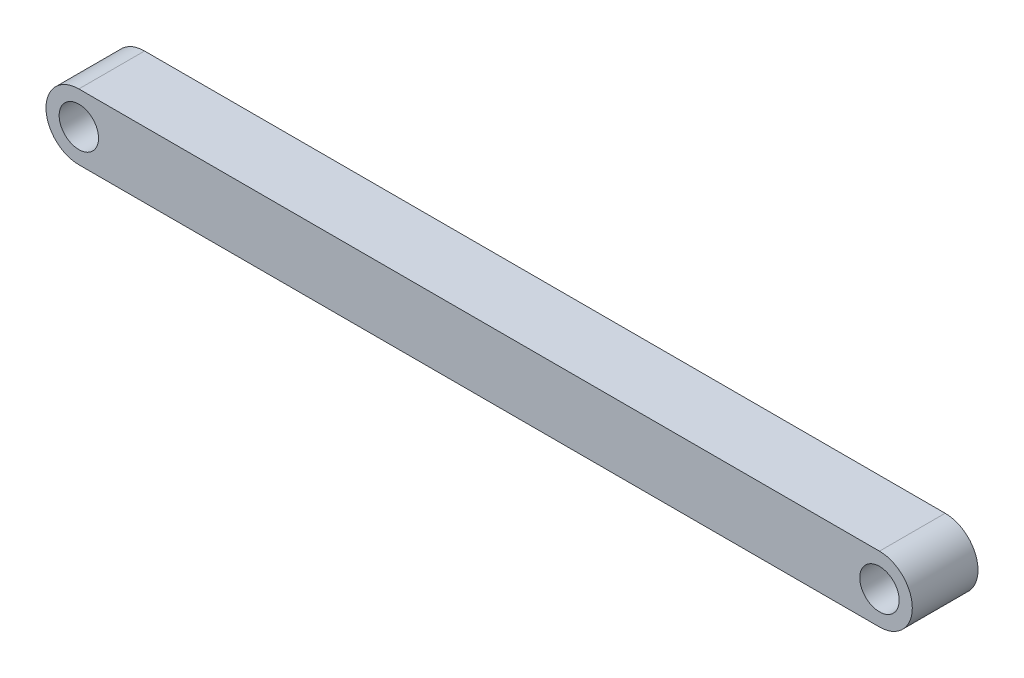
ISO-10303-21;
HEADER;
FILE_DESCRIPTION(('STEP AP214'),'2;1');
FILE_NAME('part.step','',(''),(''),'','','');
FILE_SCHEMA(('AUTOMOTIVE_DESIGN { 1 0 10303 214 1 1 1 1 }'));
ENDSEC;
DATA;
#1=APPLICATION_CONTEXT('core data for automotive mechanical design processes');
#2=APPLICATION_PROTOCOL_DEFINITION('international standard','automotive_design',2000,#1);
#3=PRODUCT_CONTEXT('',#1,'mechanical');
#4=PRODUCT('Part','Part','',(#3));
#5=PRODUCT_RELATED_PRODUCT_CATEGORY('part','',(#4));
#6=PRODUCT_DEFINITION_FORMATION('','',#4);
#7=PRODUCT_DEFINITION_CONTEXT('part definition',#1,'design');
#8=PRODUCT_DEFINITION('design','',#6,#7);
#9=PRODUCT_DEFINITION_SHAPE('','',#8);
#10=(LENGTH_UNIT() NAMED_UNIT(*) SI_UNIT(.MILLI.,.METRE.));
#11=(NAMED_UNIT(*) PLANE_ANGLE_UNIT() SI_UNIT($,.RADIAN.));
#12=(NAMED_UNIT(*) SI_UNIT($,.STERADIAN.) SOLID_ANGLE_UNIT());
#13=UNCERTAINTY_MEASURE_WITH_UNIT(LENGTH_MEASURE(1.E-05),#10,'distance_accuracy_value','');
#14=(GEOMETRIC_REPRESENTATION_CONTEXT(3) GLOBAL_UNCERTAINTY_ASSIGNED_CONTEXT((#13)) GLOBAL_UNIT_ASSIGNED_CONTEXT((#10,
#11,#12)) REPRESENTATION_CONTEXT('',''));
#15=CARTESIAN_POINT('',(0.,0.,0.));
#16=DIRECTION('',(0.,0.,1.));
#17=DIRECTION('',(1.,0.,0.));
#18=AXIS2_PLACEMENT_3D('',#15,#16,#17);
#19=CARTESIAN_POINT('',(-30.46875,0.,2.5));
#20=DIRECTION('',(0.,0.,1.));
#21=DIRECTION('',(1.,0.,0.));
#22=AXIS2_PLACEMENT_3D('',#19,#20,#21);
#23=PLANE('',#22);
#24=CARTESIAN_POINT('',(-30.46875,0.,2.5));
#25=DIRECTION('',(0.,0.,1.));
#26=DIRECTION('',(1.,0.,0.));
#27=AXIS2_PLACEMENT_3D('',#24,#25,#26);
#28=CIRCLE('',#27,1.5);
#29=CARTESIAN_POINT('',(-28.96875,0.,2.5));
#30=VERTEX_POINT('',#29);
#31=EDGE_CURVE('E102',#30,#30,#28,.T.);
#32=ORIENTED_EDGE('',*,*,#31,.F.);
#33=EDGE_LOOP('',(#32));
#34=FACE_BOUND('',#33,.T.);
#35=CARTESIAN_POINT('',(-30.46875,0.,2.5));
#36=DIRECTION('',(0.,0.,1.));
#37=DIRECTION('',(1.,0.,0.));
#38=AXIS2_PLACEMENT_3D('',#35,#36,#37);
#39=CIRCLE('',#38,2.5);
#40=CARTESIAN_POINT('',(-30.46875,2.5,2.5));
#41=VERTEX_POINT('',#40);
#42=CARTESIAN_POINT('',(-30.46875,-2.5,2.5));
#43=VERTEX_POINT('',#42);
#44=EDGE_CURVE('E87',#41,#43,#39,.T.);
#45=ORIENTED_EDGE('',*,*,#44,.T.);
#46=DIRECTION('',(1.,0.,0.));
#47=VECTOR('',#46,1.);
#48=CARTESIAN_POINT('',(-30.46875,-2.5,2.5));
#49=LINE('',#48,#47);
#50=CARTESIAN_POINT('',(30.46875,-2.5,2.5));
#51=VERTEX_POINT('',#50);
#52=EDGE_CURVE('E82',#43,#51,#49,.T.);
#53=ORIENTED_EDGE('',*,*,#52,.T.);
#54=CARTESIAN_POINT('',(30.46875,0.,2.5));
#55=DIRECTION('',(0.,0.,1.));
#56=DIRECTION('',(1.,0.,0.));
#57=AXIS2_PLACEMENT_3D('',#54,#55,#56);
#58=CIRCLE('',#57,2.5);
#59=CARTESIAN_POINT('',(30.46875,2.5,2.5));
#60=VERTEX_POINT('',#59);
#61=EDGE_CURVE('E85',#51,#60,#58,.T.);
#62=ORIENTED_EDGE('',*,*,#61,.T.);
#63=DIRECTION('',(-1.,0.,0.));
#64=VECTOR('',#63,1.);
#65=CARTESIAN_POINT('',(-30.46875,2.5,2.5));
#66=LINE('',#65,#64);
#67=EDGE_CURVE('E52',#60,#41,#66,.T.);
#68=ORIENTED_EDGE('',*,*,#67,.T.);
#69=EDGE_LOOP('',(#45,#53,#62,#68));
#70=FACE_BOUND('',#69,.T.);
#71=CARTESIAN_POINT('',(30.46875,0.,2.5));
#72=DIRECTION('',(0.,0.,1.));
#73=DIRECTION('',(1.,0.,0.));
#74=AXIS2_PLACEMENT_3D('',#71,#72,#73);
#75=CIRCLE('',#74,1.5);
#76=CARTESIAN_POINT('',(31.96875,0.,2.5));
#77=VERTEX_POINT('',#76);
#78=EDGE_CURVE('E117',#77,#77,#75,.T.);
#79=ORIENTED_EDGE('',*,*,#78,.F.);
#80=EDGE_LOOP('',(#79));
#81=FACE_BOUND('',#80,.T.);
#82=ADVANCED_FACE('F35',(#34,#70,#81),#23,.T.);
#83=CARTESIAN_POINT('',(-30.46875,0.,-2.5));
#84=DIRECTION('',(0.,0.,1.));
#85=DIRECTION('',(1.,0.,0.));
#86=AXIS2_PLACEMENT_3D('',#83,#84,#85);
#87=PLANE('',#86);
#88=CARTESIAN_POINT('',(-30.46875,0.,-2.5));
#89=DIRECTION('',(0.,0.,1.));
#90=DIRECTION('',(1.,0.,0.));
#91=AXIS2_PLACEMENT_3D('',#88,#89,#90);
#92=CIRCLE('',#91,2.5);
#93=CARTESIAN_POINT('',(-30.46875,2.5,-2.5));
#94=VERTEX_POINT('',#93);
#95=CARTESIAN_POINT('',(-30.46875,-2.5,-2.5));
#96=VERTEX_POINT('',#95);
#97=EDGE_CURVE('E99',#94,#96,#92,.T.);
#98=ORIENTED_EDGE('',*,*,#97,.F.);
#99=DIRECTION('',(-1.,0.,0.));
#100=VECTOR('',#99,1.);
#101=CARTESIAN_POINT('',(-30.46875,2.5,-2.5));
#102=LINE('',#101,#100);
#103=CARTESIAN_POINT('',(30.46875,2.5,-2.5));
#104=VERTEX_POINT('',#103);
#105=EDGE_CURVE('E75',#104,#94,#102,.T.);
#106=ORIENTED_EDGE('',*,*,#105,.F.);
#107=CARTESIAN_POINT('',(30.46875,0.,-2.5));
#108=DIRECTION('',(0.,0.,1.));
#109=DIRECTION('',(1.,0.,0.));
#110=AXIS2_PLACEMENT_3D('',#107,#108,#109);
#111=CIRCLE('',#110,2.5);
#112=CARTESIAN_POINT('',(30.46875,-2.5,-2.5));
#113=VERTEX_POINT('',#112);
#114=EDGE_CURVE('E69',#113,#104,#111,.T.);
#115=ORIENTED_EDGE('',*,*,#114,.F.);
#116=DIRECTION('',(1.,0.,0.));
#117=VECTOR('',#116,1.);
#118=CARTESIAN_POINT('',(-30.46875,-2.5,-2.5));
#119=LINE('',#118,#117);
#120=EDGE_CURVE('E91',#96,#113,#119,.T.);
#121=ORIENTED_EDGE('',*,*,#120,.F.);
#122=EDGE_LOOP('',(#98,#106,#115,#121));
#123=FACE_BOUND('',#122,.T.);
#124=CARTESIAN_POINT('',(-30.46875,0.,-2.5));
#125=DIRECTION('',(0.,0.,1.));
#126=DIRECTION('',(1.,0.,0.));
#127=AXIS2_PLACEMENT_3D('',#124,#125,#126);
#128=CIRCLE('',#127,1.5);
#129=CARTESIAN_POINT('',(-28.96875,0.,-2.5));
#130=VERTEX_POINT('',#129);
#131=EDGE_CURVE('E114',#130,#130,#128,.T.);
#132=ORIENTED_EDGE('',*,*,#131,.T.);
#133=EDGE_LOOP('',(#132));
#134=FACE_BOUND('',#133,.T.);
#135=CARTESIAN_POINT('',(30.46875,0.,-2.5));
#136=DIRECTION('',(0.,0.,1.));
#137=DIRECTION('',(1.,0.,0.));
#138=AXIS2_PLACEMENT_3D('',#135,#136,#137);
#139=CIRCLE('',#138,1.5);
#140=CARTESIAN_POINT('',(31.96875,0.,-2.5));
#141=VERTEX_POINT('',#140);
#142=EDGE_CURVE('E120',#141,#141,#139,.T.);
#143=ORIENTED_EDGE('',*,*,#142,.T.);
#144=EDGE_LOOP('',(#143));
#145=FACE_BOUND('',#144,.T.);
#146=ADVANCED_FACE('F110',(#123,#134,#145),#87,.F.);
#147=CARTESIAN_POINT('',(-30.46875,0.,2.5));
#148=DIRECTION('',(0.,0.,-1.));
#149=DIRECTION('',(-1.,0.,0.));
#150=AXIS2_PLACEMENT_3D('',#147,#148,#149);
#151=CYLINDRICAL_SURFACE('',#150,2.5);
#152=ORIENTED_EDGE('',*,*,#97,.T.);
#153=DIRECTION('',(0.,0.,-1.));
#154=VECTOR('',#153,1.);
#155=CARTESIAN_POINT('',(-30.46875,-2.5,2.5));
#156=LINE('',#155,#154);
#157=EDGE_CURVE('E11',#43,#96,#156,.T.);
#158=ORIENTED_EDGE('',*,*,#157,.F.);
#159=ORIENTED_EDGE('',*,*,#44,.F.);
#160=DIRECTION('',(0.,0.,-1.));
#161=VECTOR('',#160,1.);
#162=CARTESIAN_POINT('',(-30.46875,2.5,2.5));
#163=LINE('',#162,#161);
#164=EDGE_CURVE('E95',#41,#94,#163,.T.);
#165=ORIENTED_EDGE('',*,*,#164,.T.);
#166=EDGE_LOOP('',(#152,#158,#159,#165));
#167=FACE_BOUND('',#166,.T.);
#168=ADVANCED_FACE('F37',(#167),#151,.T.);
#169=CARTESIAN_POINT('',(-30.46875,-2.5,2.5));
#170=DIRECTION('',(0.,1.,0.));
#171=DIRECTION('',(0.,0.,1.));
#172=AXIS2_PLACEMENT_3D('',#169,#170,#171);
#173=PLANE('',#172);
#174=ORIENTED_EDGE('',*,*,#120,.T.);
#175=DIRECTION('',(0.,0.,-1.));
#176=VECTOR('',#175,1.);
#177=CARTESIAN_POINT('',(30.46875,-2.5,2.5));
#178=LINE('',#177,#176);
#179=EDGE_CURVE('E44',#51,#113,#178,.T.);
#180=ORIENTED_EDGE('',*,*,#179,.F.);
#181=ORIENTED_EDGE('',*,*,#52,.F.);
#182=ORIENTED_EDGE('',*,*,#157,.T.);
#183=EDGE_LOOP('',(#174,#180,#181,#182));
#184=FACE_BOUND('',#183,.T.);
#185=ADVANCED_FACE('F90',(#184),#173,.F.);
#186=CARTESIAN_POINT('',(30.46875,0.,2.5));
#187=DIRECTION('',(0.,0.,-1.));
#188=DIRECTION('',(-1.,0.,0.));
#189=AXIS2_PLACEMENT_3D('',#186,#187,#188);
#190=CYLINDRICAL_SURFACE('',#189,2.5);
#191=ORIENTED_EDGE('',*,*,#114,.T.);
#192=DIRECTION('',(0.,0.,-1.));
#193=VECTOR('',#192,1.);
#194=CARTESIAN_POINT('',(30.46875,2.5,2.5));
#195=LINE('',#194,#193);
#196=EDGE_CURVE('E92',#60,#104,#195,.T.);
#197=ORIENTED_EDGE('',*,*,#196,.F.);
#198=ORIENTED_EDGE('',*,*,#61,.F.);
#199=ORIENTED_EDGE('',*,*,#179,.T.);
#200=EDGE_LOOP('',(#191,#197,#198,#199));
#201=FACE_BOUND('',#200,.T.);
#202=ADVANCED_FACE('F93',(#201),#190,.T.);
#203=CARTESIAN_POINT('',(-30.46875,2.5,2.5));
#204=DIRECTION('',(0.,-1.,0.));
#205=DIRECTION('',(0.,0.,-1.));
#206=AXIS2_PLACEMENT_3D('',#203,#204,#205);
#207=PLANE('',#206);
#208=ORIENTED_EDGE('',*,*,#105,.T.);
#209=ORIENTED_EDGE('',*,*,#164,.F.);
#210=ORIENTED_EDGE('',*,*,#67,.F.);
#211=ORIENTED_EDGE('',*,*,#196,.T.);
#212=EDGE_LOOP('',(#208,#209,#210,#211));
#213=FACE_BOUND('',#212,.T.);
#214=ADVANCED_FACE('F107',(#213),#207,.F.);
#215=CARTESIAN_POINT('',(-30.46875,0.,2.5));
#216=DIRECTION('',(0.,0.,-1.));
#217=DIRECTION('',(-1.,0.,0.));
#218=AXIS2_PLACEMENT_3D('',#215,#216,#217);
#219=CYLINDRICAL_SURFACE('',#218,1.5);
#220=ORIENTED_EDGE('',*,*,#31,.T.);
#221=EDGE_LOOP('',(#220));
#222=FACE_BOUND('',#221,.T.);
#223=ORIENTED_EDGE('',*,*,#131,.F.);
#224=EDGE_LOOP('',(#223));
#225=FACE_BOUND('',#224,.T.);
#226=ADVANCED_FACE('F137',(#222,#225),#219,.F.);
#227=CARTESIAN_POINT('',(30.46875,0.,2.5));
#228=DIRECTION('',(0.,0.,-1.));
#229=DIRECTION('',(-1.,0.,0.));
#230=AXIS2_PLACEMENT_3D('',#227,#228,#229);
#231=CYLINDRICAL_SURFACE('',#230,1.5);
#232=ORIENTED_EDGE('',*,*,#78,.T.);
#233=EDGE_LOOP('',(#232));
#234=FACE_BOUND('',#233,.T.);
#235=ORIENTED_EDGE('',*,*,#142,.F.);
#236=EDGE_LOOP('',(#235));
#237=FACE_BOUND('',#236,.T.);
#238=ADVANCED_FACE('F126',(#234,#237),#231,.F.);
#239=CLOSED_SHELL('',(#82,#146,#168,#185,#202,#214,#226,#238));
#240=MANIFOLD_SOLID_BREP('B2',#239);
#241=ADVANCED_BREP_SHAPE_REPRESENTATION('',(#18,#240),#14);
#242=SHAPE_DEFINITION_REPRESENTATION(#9,#241);
ENDSEC;
END-ISO-10303-21;
